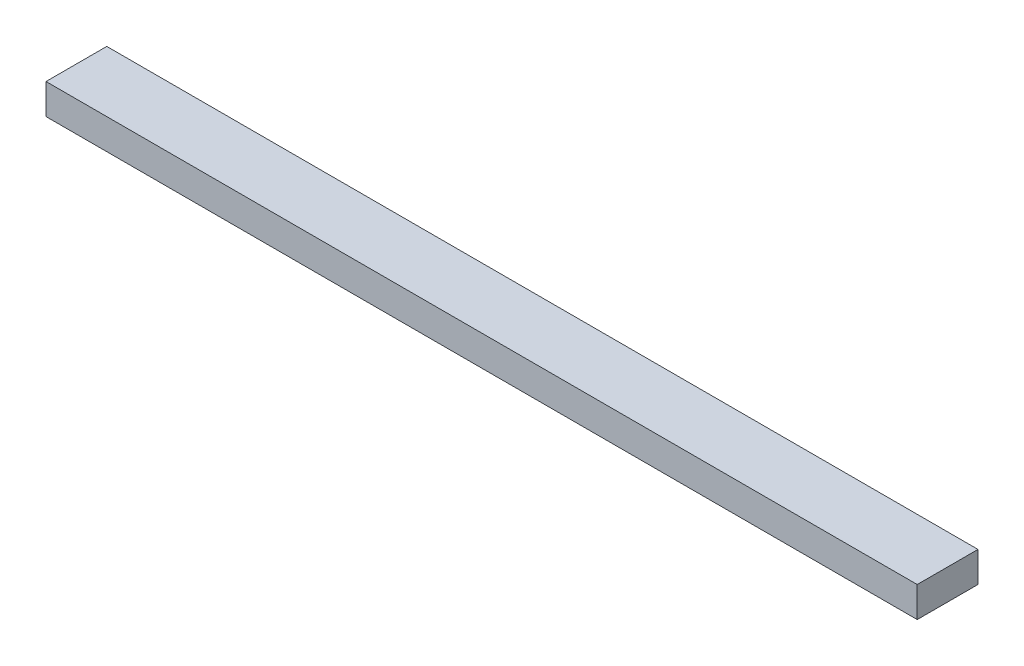
ISO-10303-21;
HEADER;
FILE_DESCRIPTION(('STEP AP214'),'2;1');
FILE_NAME('part.step','',(''),(''),'','','');
FILE_SCHEMA(('AUTOMOTIVE_DESIGN { 1 0 10303 214 1 1 1 1 }'));
ENDSEC;
DATA;
#1=APPLICATION_CONTEXT('core data for automotive mechanical design processes');
#2=APPLICATION_PROTOCOL_DEFINITION('international standard','automotive_design',2000,#1);
#3=PRODUCT_CONTEXT('',#1,'mechanical');
#4=PRODUCT('Part','Part','',(#3));
#5=PRODUCT_RELATED_PRODUCT_CATEGORY('part','',(#4));
#6=PRODUCT_DEFINITION_FORMATION('','',#4);
#7=PRODUCT_DEFINITION_CONTEXT('part definition',#1,'design');
#8=PRODUCT_DEFINITION('design','',#6,#7);
#9=PRODUCT_DEFINITION_SHAPE('','',#8);
#10=(LENGTH_UNIT() NAMED_UNIT(*) SI_UNIT(.MILLI.,.METRE.));
#11=(NAMED_UNIT(*) PLANE_ANGLE_UNIT() SI_UNIT($,.RADIAN.));
#12=(NAMED_UNIT(*) SI_UNIT($,.STERADIAN.) SOLID_ANGLE_UNIT());
#13=UNCERTAINTY_MEASURE_WITH_UNIT(LENGTH_MEASURE(1.E-05),#10,'distance_accuracy_value','');
#14=(GEOMETRIC_REPRESENTATION_CONTEXT(3) GLOBAL_UNCERTAINTY_ASSIGNED_CONTEXT((#13)) GLOBAL_UNIT_ASSIGNED_CONTEXT((#10,
#11,#12)) REPRESENTATION_CONTEXT('',''));
#15=CARTESIAN_POINT('',(0.,0.,0.));
#16=DIRECTION('',(0.,0.,1.));
#17=DIRECTION('',(1.,0.,0.));
#18=AXIS2_PLACEMENT_3D('',#15,#16,#17);
#19=CARTESIAN_POINT('',(-273.05,152.4,38.1));
#20=DIRECTION('',(1.,0.,0.));
#21=DIRECTION('',(0.,0.,-1.));
#22=AXIS2_PLACEMENT_3D('',#19,#20,#21);
#23=PLANE('',#22);
#24=DIRECTION('',(0.,-1.,0.));
#25=VECTOR('',#24,1.);
#26=CARTESIAN_POINT('',(-273.05,152.4,0.));
#27=LINE('',#26,#25);
#28=CARTESIAN_POINT('',(-273.05,152.4,0.));
#29=VERTEX_POINT('',#28);
#30=CARTESIAN_POINT('',(-273.05,133.35,0.));
#31=VERTEX_POINT('',#30);
#32=EDGE_CURVE('E115',#29,#31,#27,.T.);
#33=ORIENTED_EDGE('',*,*,#32,.T.);
#34=DIRECTION('',(0.,0.,-1.));
#35=VECTOR('',#34,1.);
#36=CARTESIAN_POINT('',(-273.05,133.35,38.1));
#37=LINE('',#36,#35);
#38=CARTESIAN_POINT('',(-273.05,133.35,38.1));
#39=VERTEX_POINT('',#38);
#40=EDGE_CURVE('E11',#39,#31,#37,.T.);
#41=ORIENTED_EDGE('',*,*,#40,.F.);
#42=DIRECTION('',(0.,-1.,0.));
#43=VECTOR('',#42,1.);
#44=CARTESIAN_POINT('',(-273.05,152.4,38.1));
#45=LINE('',#44,#43);
#46=CARTESIAN_POINT('',(-273.05,152.4,38.1));
#47=VERTEX_POINT('',#46);
#48=EDGE_CURVE('E99',#47,#39,#45,.T.);
#49=ORIENTED_EDGE('',*,*,#48,.F.);
#50=DIRECTION('',(0.,0.,-1.));
#51=VECTOR('',#50,1.);
#52=CARTESIAN_POINT('',(-273.05,152.4,38.1));
#53=LINE('',#52,#51);
#54=EDGE_CURVE('E111',#47,#29,#53,.T.);
#55=ORIENTED_EDGE('',*,*,#54,.T.);
#56=EDGE_LOOP('',(#33,#41,#49,#55));
#57=FACE_BOUND('',#56,.T.);
#58=ADVANCED_FACE('F47',(#57),#23,.F.);
#59=CARTESIAN_POINT('',(-273.05,133.35,38.1));
#60=DIRECTION('',(0.,1.,0.));
#61=DIRECTION('',(0.,0.,1.));
#62=AXIS2_PLACEMENT_3D('',#59,#60,#61);
#63=PLANE('',#62);
#64=DIRECTION('',(1.,0.,0.));
#65=VECTOR('',#64,1.);
#66=CARTESIAN_POINT('',(-273.05,133.35,0.));
#67=LINE('',#66,#65);
#68=CARTESIAN_POINT('',(273.05,133.35,0.));
#69=VERTEX_POINT('',#68);
#70=EDGE_CURVE('E104',#31,#69,#67,.T.);
#71=ORIENTED_EDGE('',*,*,#70,.T.);
#72=DIRECTION('',(0.,0.,-1.));
#73=VECTOR('',#72,1.);
#74=CARTESIAN_POINT('',(273.05,133.35,38.1));
#75=LINE('',#74,#73);
#76=CARTESIAN_POINT('',(273.05,133.35,38.1));
#77=VERTEX_POINT('',#76);
#78=EDGE_CURVE('E56',#77,#69,#75,.T.);
#79=ORIENTED_EDGE('',*,*,#78,.F.);
#80=DIRECTION('',(1.,0.,0.));
#81=VECTOR('',#80,1.);
#82=CARTESIAN_POINT('',(-273.05,133.35,38.1));
#83=LINE('',#82,#81);
#84=EDGE_CURVE('E94',#39,#77,#83,.T.);
#85=ORIENTED_EDGE('',*,*,#84,.F.);
#86=ORIENTED_EDGE('',*,*,#40,.T.);
#87=EDGE_LOOP('',(#71,#79,#85,#86));
#88=FACE_BOUND('',#87,.T.);
#89=ADVANCED_FACE('F103',(#88),#63,.F.);
#90=CARTESIAN_POINT('',(273.05,152.4,38.1));
#91=DIRECTION('',(-1.,0.,0.));
#92=DIRECTION('',(0.,0.,1.));
#93=AXIS2_PLACEMENT_3D('',#90,#91,#92);
#94=PLANE('',#93);
#95=DIRECTION('',(0.,1.,0.));
#96=VECTOR('',#95,1.);
#97=CARTESIAN_POINT('',(273.05,152.4,0.));
#98=LINE('',#97,#96);
#99=CARTESIAN_POINT('',(273.05,152.4,0.));
#100=VERTEX_POINT('',#99);
#101=EDGE_CURVE('E81',#69,#100,#98,.T.);
#102=ORIENTED_EDGE('',*,*,#101,.T.);
#103=DIRECTION('',(0.,0.,-1.));
#104=VECTOR('',#103,1.);
#105=CARTESIAN_POINT('',(273.05,152.4,38.1));
#106=LINE('',#105,#104);
#107=CARTESIAN_POINT('',(273.05,152.4,38.1));
#108=VERTEX_POINT('',#107);
#109=EDGE_CURVE('E106',#108,#100,#106,.T.);
#110=ORIENTED_EDGE('',*,*,#109,.F.);
#111=DIRECTION('',(0.,1.,0.));
#112=VECTOR('',#111,1.);
#113=CARTESIAN_POINT('',(273.05,152.4,38.1));
#114=LINE('',#113,#112);
#115=EDGE_CURVE('E97',#77,#108,#114,.T.);
#116=ORIENTED_EDGE('',*,*,#115,.F.);
#117=ORIENTED_EDGE('',*,*,#78,.T.);
#118=EDGE_LOOP('',(#102,#110,#116,#117));
#119=FACE_BOUND('',#118,.T.);
#120=ADVANCED_FACE('F107',(#119),#94,.F.);
#121=CARTESIAN_POINT('',(-273.05,152.4,38.1));
#122=DIRECTION('',(0.,-1.,0.));
#123=DIRECTION('',(0.,0.,-1.));
#124=AXIS2_PLACEMENT_3D('',#121,#122,#123);
#125=PLANE('',#124);
#126=DIRECTION('',(-1.,0.,0.));
#127=VECTOR('',#126,1.);
#128=CARTESIAN_POINT('',(-273.05,152.4,0.));
#129=LINE('',#128,#127);
#130=EDGE_CURVE('E87',#100,#29,#129,.T.);
#131=ORIENTED_EDGE('',*,*,#130,.T.);
#132=ORIENTED_EDGE('',*,*,#54,.F.);
#133=DIRECTION('',(-1.,0.,0.));
#134=VECTOR('',#133,1.);
#135=CARTESIAN_POINT('',(-273.05,152.4,38.1));
#136=LINE('',#135,#134);
#137=EDGE_CURVE('E64',#108,#47,#136,.T.);
#138=ORIENTED_EDGE('',*,*,#137,.F.);
#139=ORIENTED_EDGE('',*,*,#109,.T.);
#140=EDGE_LOOP('',(#131,#132,#138,#139));
#141=FACE_BOUND('',#140,.T.);
#142=ADVANCED_FACE('F128',(#141),#125,.F.);
#143=CARTESIAN_POINT('',(0.,0.,38.1));
#144=DIRECTION('',(0.,0.,1.));
#145=DIRECTION('',(1.,0.,0.));
#146=AXIS2_PLACEMENT_3D('',#143,#144,#145);
#147=PLANE('',#146);
#148=ORIENTED_EDGE('',*,*,#48,.T.);
#149=ORIENTED_EDGE('',*,*,#84,.T.);
#150=ORIENTED_EDGE('',*,*,#115,.T.);
#151=ORIENTED_EDGE('',*,*,#137,.T.);
#152=EDGE_LOOP('',(#148,#149,#150,#151));
#153=FACE_BOUND('',#152,.T.);
#154=ADVANCED_FACE('F95',(#153),#147,.T.);
#155=CARTESIAN_POINT('',(0.,0.,0.));
#156=DIRECTION('',(0.,0.,1.));
#157=DIRECTION('',(1.,0.,0.));
#158=AXIS2_PLACEMENT_3D('',#155,#156,#157);
#159=PLANE('',#158);
#160=ORIENTED_EDGE('',*,*,#32,.F.);
#161=ORIENTED_EDGE('',*,*,#130,.F.);
#162=ORIENTED_EDGE('',*,*,#101,.F.);
#163=ORIENTED_EDGE('',*,*,#70,.F.);
#164=EDGE_LOOP('',(#160,#161,#162,#163));
#165=FACE_BOUND('',#164,.T.);
#166=ADVANCED_FACE('F131',(#165),#159,.F.);
#167=CLOSED_SHELL('',(#58,#89,#120,#142,#154,#166));
#168=MANIFOLD_SOLID_BREP('B2',#167);
#169=ADVANCED_BREP_SHAPE_REPRESENTATION('',(#18,#168),#14);
#170=SHAPE_DEFINITION_REPRESENTATION(#9,#169);
ENDSEC;
END-ISO-10303-21;
